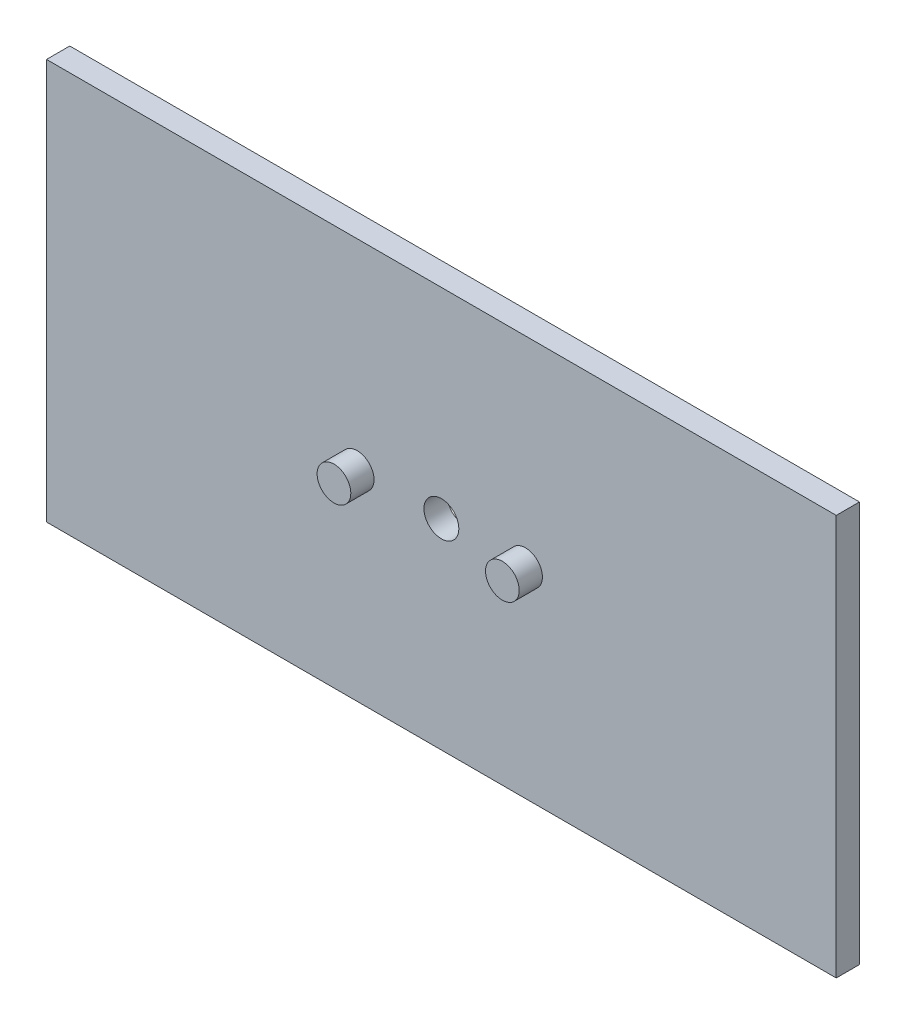
ISO-10303-21;
HEADER;
FILE_DESCRIPTION(('STEP AP214'),'2;1');
FILE_NAME('part.step','',(''),(''),'','','');
FILE_SCHEMA(('AUTOMOTIVE_DESIGN { 1 0 10303 214 1 1 1 1 }'));
ENDSEC;
DATA;
#1=APPLICATION_CONTEXT('core data for automotive mechanical design processes');
#2=APPLICATION_PROTOCOL_DEFINITION('international standard','automotive_design',2000,#1);
#3=PRODUCT_CONTEXT('',#1,'mechanical');
#4=PRODUCT('Part','Part','',(#3));
#5=PRODUCT_RELATED_PRODUCT_CATEGORY('part','',(#4));
#6=PRODUCT_DEFINITION_FORMATION('','',#4);
#7=PRODUCT_DEFINITION_CONTEXT('part definition',#1,'design');
#8=PRODUCT_DEFINITION('design','',#6,#7);
#9=PRODUCT_DEFINITION_SHAPE('','',#8);
#10=(LENGTH_UNIT() NAMED_UNIT(*) SI_UNIT(.MILLI.,.METRE.));
#11=(NAMED_UNIT(*) PLANE_ANGLE_UNIT() SI_UNIT($,.RADIAN.));
#12=(NAMED_UNIT(*) SI_UNIT($,.STERADIAN.) SOLID_ANGLE_UNIT());
#13=UNCERTAINTY_MEASURE_WITH_UNIT(LENGTH_MEASURE(1.E-05),#10,'distance_accuracy_value','');
#14=(GEOMETRIC_REPRESENTATION_CONTEXT(3) GLOBAL_UNCERTAINTY_ASSIGNED_CONTEXT((#13)) GLOBAL_UNIT_ASSIGNED_CONTEXT((#10,
#11,#12)) REPRESENTATION_CONTEXT('',''));
#15=CARTESIAN_POINT('',(0.,0.,0.));
#16=DIRECTION('',(0.,0.,1.));
#17=DIRECTION('',(1.,0.,0.));
#18=AXIS2_PLACEMENT_3D('',#15,#16,#17);
#19=CARTESIAN_POINT('',(34.,-17.25,2.));
#20=DIRECTION('',(-1.,0.,0.));
#21=DIRECTION('',(0.,0.,1.));
#22=AXIS2_PLACEMENT_3D('',#19,#20,#21);
#23=PLANE('',#22);
#24=DIRECTION('',(0.,1.,0.));
#25=VECTOR('',#24,1.);
#26=CARTESIAN_POINT('',(34.,-17.25,0.));
#27=LINE('',#26,#25);
#28=CARTESIAN_POINT('',(34.,-17.25,0.));
#29=VERTEX_POINT('',#28);
#30=CARTESIAN_POINT('',(34.,17.25,0.));
#31=VERTEX_POINT('',#30);
#32=EDGE_CURVE('E113',#29,#31,#27,.T.);
#33=ORIENTED_EDGE('',*,*,#32,.T.);
#34=DIRECTION('',(0.,0.,-1.));
#35=VECTOR('',#34,1.);
#36=CARTESIAN_POINT('',(34.,17.25,2.));
#37=LINE('',#36,#35);
#38=CARTESIAN_POINT('',(34.,17.25,2.));
#39=VERTEX_POINT('',#38);
#40=EDGE_CURVE('E102',#39,#31,#37,.T.);
#41=ORIENTED_EDGE('',*,*,#40,.F.);
#42=DIRECTION('',(0.,1.,0.));
#43=VECTOR('',#42,1.);
#44=CARTESIAN_POINT('',(34.,-17.25,2.));
#45=LINE('',#44,#43);
#46=CARTESIAN_POINT('',(34.,-17.25,2.));
#47=VERTEX_POINT('',#46);
#48=EDGE_CURVE('E94',#47,#39,#45,.T.);
#49=ORIENTED_EDGE('',*,*,#48,.F.);
#50=DIRECTION('',(0.,0.,-1.));
#51=VECTOR('',#50,1.);
#52=CARTESIAN_POINT('',(34.,-17.25,2.));
#53=LINE('',#52,#51);
#54=EDGE_CURVE('E109',#47,#29,#53,.T.);
#55=ORIENTED_EDGE('',*,*,#54,.T.);
#56=EDGE_LOOP('',(#33,#41,#49,#55));
#57=FACE_BOUND('',#56,.T.);
#58=ADVANCED_FACE('F41',(#57),#23,.F.);
#59=CARTESIAN_POINT('',(-34.,17.25,2.));
#60=DIRECTION('',(0.,-1.,0.));
#61=DIRECTION('',(0.,0.,-1.));
#62=AXIS2_PLACEMENT_3D('',#59,#60,#61);
#63=PLANE('',#62);
#64=DIRECTION('',(-1.,0.,0.));
#65=VECTOR('',#64,1.);
#66=CARTESIAN_POINT('',(-34.,17.25,0.));
#67=LINE('',#66,#65);
#68=CARTESIAN_POINT('',(-34.,17.25,0.));
#69=VERTEX_POINT('',#68);
#70=EDGE_CURVE('E100',#31,#69,#67,.T.);
#71=ORIENTED_EDGE('',*,*,#70,.T.);
#72=DIRECTION('',(0.,0.,-1.));
#73=VECTOR('',#72,1.);
#74=CARTESIAN_POINT('',(-34.,17.25,2.));
#75=LINE('',#74,#73);
#76=CARTESIAN_POINT('',(-34.,17.25,2.));
#77=VERTEX_POINT('',#76);
#78=EDGE_CURVE('E98',#77,#69,#75,.T.);
#79=ORIENTED_EDGE('',*,*,#78,.F.);
#80=DIRECTION('',(-1.,0.,0.));
#81=VECTOR('',#80,1.);
#82=CARTESIAN_POINT('',(-34.,17.25,2.));
#83=LINE('',#82,#81);
#84=EDGE_CURVE('E89',#39,#77,#83,.T.);
#85=ORIENTED_EDGE('',*,*,#84,.F.);
#86=ORIENTED_EDGE('',*,*,#40,.T.);
#87=EDGE_LOOP('',(#71,#79,#85,#86));
#88=FACE_BOUND('',#87,.T.);
#89=ADVANCED_FACE('F99',(#88),#63,.F.);
#90=CARTESIAN_POINT('',(-34.,-17.25,2.));
#91=DIRECTION('',(1.,0.,0.));
#92=DIRECTION('',(0.,0.,-1.));
#93=AXIS2_PLACEMENT_3D('',#90,#91,#92);
#94=PLANE('',#93);
#95=DIRECTION('',(0.,-1.,0.));
#96=VECTOR('',#95,1.);
#97=CARTESIAN_POINT('',(-34.,-17.25,0.));
#98=LINE('',#97,#96);
#99=CARTESIAN_POINT('',(-34.,-17.25,0.));
#100=VERTEX_POINT('',#99);
#101=EDGE_CURVE('E75',#69,#100,#98,.T.);
#102=ORIENTED_EDGE('',*,*,#101,.T.);
#103=DIRECTION('',(0.,0.,-1.));
#104=VECTOR('',#103,1.);
#105=CARTESIAN_POINT('',(-34.,-17.25,2.));
#106=LINE('',#105,#104);
#107=CARTESIAN_POINT('',(-34.,-17.25,2.));
#108=VERTEX_POINT('',#107);
#109=EDGE_CURVE('E103',#108,#100,#106,.T.);
#110=ORIENTED_EDGE('',*,*,#109,.F.);
#111=DIRECTION('',(0.,-1.,0.));
#112=VECTOR('',#111,1.);
#113=CARTESIAN_POINT('',(-34.,-17.25,2.));
#114=LINE('',#113,#112);
#115=EDGE_CURVE('E92',#77,#108,#114,.T.);
#116=ORIENTED_EDGE('',*,*,#115,.F.);
#117=ORIENTED_EDGE('',*,*,#78,.T.);
#118=EDGE_LOOP('',(#102,#110,#116,#117));
#119=FACE_BOUND('',#118,.T.);
#120=ADVANCED_FACE('F105',(#119),#94,.F.);
#121=CARTESIAN_POINT('',(-34.,-17.25,2.));
#122=DIRECTION('',(0.,1.,0.));
#123=DIRECTION('',(0.,0.,1.));
#124=AXIS2_PLACEMENT_3D('',#121,#122,#123);
#125=PLANE('',#124);
#126=DIRECTION('',(1.,0.,0.));
#127=VECTOR('',#126,1.);
#128=CARTESIAN_POINT('',(-34.,-17.25,0.));
#129=LINE('',#128,#127);
#130=EDGE_CURVE('E81',#100,#29,#129,.T.);
#131=ORIENTED_EDGE('',*,*,#130,.T.);
#132=ORIENTED_EDGE('',*,*,#54,.F.);
#133=DIRECTION('',(1.,0.,0.));
#134=VECTOR('',#133,1.);
#135=CARTESIAN_POINT('',(-34.,-17.25,2.));
#136=LINE('',#135,#134);
#137=EDGE_CURVE('E58',#108,#47,#136,.T.);
#138=ORIENTED_EDGE('',*,*,#137,.F.);
#139=ORIENTED_EDGE('',*,*,#109,.T.);
#140=EDGE_LOOP('',(#131,#132,#138,#139));
#141=FACE_BOUND('',#140,.T.);
#142=ADVANCED_FACE('F137',(#141),#125,.F.);
#143=CARTESIAN_POINT('',(0.,0.,2.));
#144=DIRECTION('',(0.,0.,-1.));
#145=DIRECTION('',(-1.,0.,0.));
#146=AXIS2_PLACEMENT_3D('',#143,#144,#145);
#147=PLANE('',#146);
#148=CARTESIAN_POINT('',(0.,0.,2.));
#149=DIRECTION('',(0.,0.,1.));
#150=DIRECTION('',(1.,0.,0.));
#151=AXIS2_PLACEMENT_3D('',#148,#149,#150);
#152=CIRCLE('',#151,1.5);
#153=CARTESIAN_POINT('',(1.5,0.,2.));
#154=VERTEX_POINT('',#153);
#155=EDGE_CURVE('E167',#154,#154,#152,.T.);
#156=ORIENTED_EDGE('',*,*,#155,.F.);
#157=EDGE_LOOP('',(#156));
#158=FACE_BOUND('',#157,.T.);
#159=CARTESIAN_POINT('',(7.25,0.,2.));
#160=DIRECTION('',(0.,0.,-1.));
#161=DIRECTION('',(-1.,0.,0.));
#162=AXIS2_PLACEMENT_3D('',#159,#160,#161);
#163=CIRCLE('',#162,1.45);
#164=CARTESIAN_POINT('',(5.8,0.,2.));
#165=VERTEX_POINT('',#164);
#166=EDGE_CURVE('E11',#165,#165,#163,.F.);
#167=ORIENTED_EDGE('',*,*,#166,.F.);
#168=EDGE_LOOP('',(#167));
#169=FACE_BOUND('',#168,.T.);
#170=CARTESIAN_POINT('',(-7.25,0.,2.));
#171=DIRECTION('',(0.,0.,-1.));
#172=DIRECTION('',(-1.,0.,0.));
#173=AXIS2_PLACEMENT_3D('',#170,#171,#172);
#174=CIRCLE('',#173,1.45);
#175=CARTESIAN_POINT('',(-8.7,0.,2.));
#176=VERTEX_POINT('',#175);
#177=EDGE_CURVE('E50',#176,#176,#174,.F.);
#178=ORIENTED_EDGE('',*,*,#177,.F.);
#179=EDGE_LOOP('',(#178));
#180=FACE_BOUND('',#179,.T.);
#181=ORIENTED_EDGE('',*,*,#48,.T.);
#182=ORIENTED_EDGE('',*,*,#84,.T.);
#183=ORIENTED_EDGE('',*,*,#115,.T.);
#184=ORIENTED_EDGE('',*,*,#137,.T.);
#185=EDGE_LOOP('',(#181,#182,#183,#184));
#186=FACE_BOUND('',#185,.T.);
#187=ADVANCED_FACE('F90',(#158,#169,#180,#186),#147,.F.);
#188=CARTESIAN_POINT('',(0.,0.,0.));
#189=DIRECTION('',(0.,0.,-1.));
#190=DIRECTION('',(-1.,0.,0.));
#191=AXIS2_PLACEMENT_3D('',#188,#189,#190);
#192=PLANE('',#191);
#193=CARTESIAN_POINT('',(0.,0.,0.));
#194=DIRECTION('',(0.,0.,1.));
#195=DIRECTION('',(1.,0.,0.));
#196=AXIS2_PLACEMENT_3D('',#193,#194,#195);
#197=CIRCLE('',#196,1.5);
#198=CARTESIAN_POINT('',(1.5,0.,0.));
#199=VERTEX_POINT('',#198);
#200=EDGE_CURVE('E166',#199,#199,#197,.T.);
#201=ORIENTED_EDGE('',*,*,#200,.T.);
#202=EDGE_LOOP('',(#201));
#203=FACE_BOUND('',#202,.T.);
#204=ORIENTED_EDGE('',*,*,#32,.F.);
#205=ORIENTED_EDGE('',*,*,#130,.F.);
#206=ORIENTED_EDGE('',*,*,#101,.F.);
#207=ORIENTED_EDGE('',*,*,#70,.F.);
#208=EDGE_LOOP('',(#204,#205,#206,#207));
#209=FACE_BOUND('',#208,.T.);
#210=ADVANCED_FACE('F136',(#203,#209),#192,.T.);
#211=CARTESIAN_POINT('',(-7.25,0.,4.));
#212=DIRECTION('',(0.,0.,-1.));
#213=DIRECTION('',(-1.,0.,0.));
#214=AXIS2_PLACEMENT_3D('',#211,#212,#213);
#215=CYLINDRICAL_SURFACE('',#214,1.45);
#216=CARTESIAN_POINT('',(-7.25,0.,4.));
#217=DIRECTION('',(0.,0.,1.));
#218=DIRECTION('',(1.,0.,0.));
#219=AXIS2_PLACEMENT_3D('',#216,#217,#218);
#220=CIRCLE('',#219,1.45);
#221=CARTESIAN_POINT('',(-5.8,0.,4.));
#222=VERTEX_POINT('',#221);
#223=EDGE_CURVE('E117',#222,#222,#220,.T.);
#224=ORIENTED_EDGE('',*,*,#223,.F.);
#225=EDGE_LOOP('',(#224));
#226=FACE_BOUND('',#225,.T.);
#227=ORIENTED_EDGE('',*,*,#177,.T.);
#228=EDGE_LOOP('',(#227));
#229=FACE_BOUND('',#228,.T.);
#230=ADVANCED_FACE('F133',(#226,#229),#215,.T.);
#231=CARTESIAN_POINT('',(-7.25,0.,4.));
#232=DIRECTION('',(0.,0.,1.));
#233=DIRECTION('',(1.,0.,0.));
#234=AXIS2_PLACEMENT_3D('',#231,#232,#233);
#235=PLANE('',#234);
#236=ORIENTED_EDGE('',*,*,#223,.T.);
#237=EDGE_LOOP('',(#236));
#238=FACE_BOUND('',#237,.T.);
#239=ADVANCED_FACE('F189',(#238),#235,.T.);
#240=CARTESIAN_POINT('',(7.25,0.,4.));
#241=DIRECTION('',(0.,0.,-1.));
#242=DIRECTION('',(-1.,0.,0.));
#243=AXIS2_PLACEMENT_3D('',#240,#241,#242);
#244=CYLINDRICAL_SURFACE('',#243,1.45);
#245=CARTESIAN_POINT('',(7.25,0.,4.));
#246=DIRECTION('',(0.,0.,1.));
#247=DIRECTION('',(1.,0.,0.));
#248=AXIS2_PLACEMENT_3D('',#245,#246,#247);
#249=CIRCLE('',#248,1.45);
#250=CARTESIAN_POINT('',(8.7,0.,4.));
#251=VERTEX_POINT('',#250);
#252=EDGE_CURVE('E162',#251,#251,#249,.T.);
#253=ORIENTED_EDGE('',*,*,#252,.F.);
#254=EDGE_LOOP('',(#253));
#255=FACE_BOUND('',#254,.T.);
#256=ORIENTED_EDGE('',*,*,#166,.T.);
#257=EDGE_LOOP('',(#256));
#258=FACE_BOUND('',#257,.T.);
#259=ADVANCED_FACE('F183',(#255,#258),#244,.T.);
#260=CARTESIAN_POINT('',(7.25,0.,4.));
#261=DIRECTION('',(0.,0.,1.));
#262=DIRECTION('',(1.,0.,0.));
#263=AXIS2_PLACEMENT_3D('',#260,#261,#262);
#264=PLANE('',#263);
#265=ORIENTED_EDGE('',*,*,#252,.T.);
#266=EDGE_LOOP('',(#265));
#267=FACE_BOUND('',#266,.T.);
#268=ADVANCED_FACE('F178',(#267),#264,.T.);
#269=CARTESIAN_POINT('',(0.,0.,0.));
#270=DIRECTION('',(0.,0.,1.));
#271=DIRECTION('',(1.,0.,0.));
#272=AXIS2_PLACEMENT_3D('',#269,#270,#271);
#273=CYLINDRICAL_SURFACE('',#272,1.5);
#274=ORIENTED_EDGE('',*,*,#200,.F.);
#275=EDGE_LOOP('',(#274));
#276=FACE_BOUND('',#275,.T.);
#277=ORIENTED_EDGE('',*,*,#155,.T.);
#278=EDGE_LOOP('',(#277));
#279=FACE_BOUND('',#278,.T.);
#280=ADVANCED_FACE('F175',(#276,#279),#273,.F.);
#281=CLOSED_SHELL('',(#58,#89,#120,#142,#187,#210,#230,#239,#259,#268,#280));
#282=MANIFOLD_SOLID_BREP('B2',#281);
#283=ADVANCED_BREP_SHAPE_REPRESENTATION('',(#18,#282),#14);
#284=SHAPE_DEFINITION_REPRESENTATION(#9,#283);
ENDSEC;
END-ISO-10303-21;
